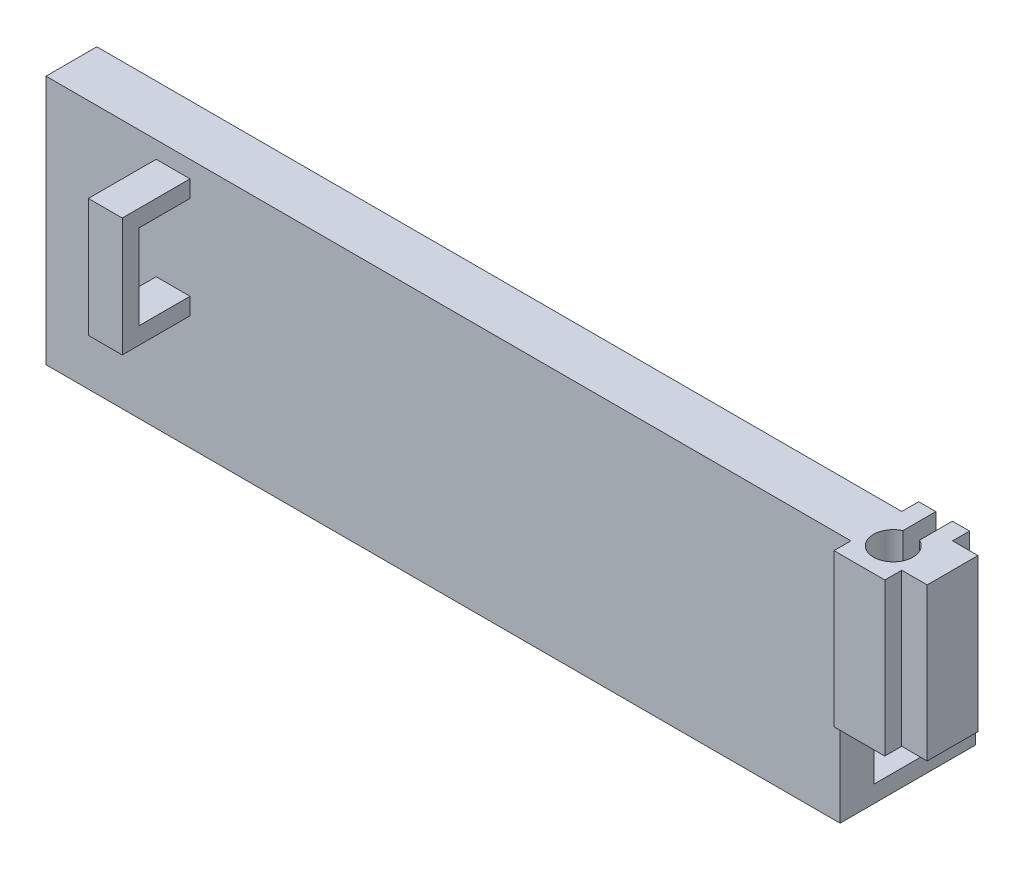
ISO-10303-21;
HEADER;
FILE_DESCRIPTION(('STEP AP214'),'2;1');
FILE_NAME('part.step','',(''),(''),'','','');
FILE_SCHEMA(('AUTOMOTIVE_DESIGN { 1 0 10303 214 1 1 1 1 }'));
ENDSEC;
DATA;
#1=APPLICATION_CONTEXT('core data for automotive mechanical design processes');
#2=APPLICATION_PROTOCOL_DEFINITION('international standard','automotive_design',2000,#1);
#3=PRODUCT_CONTEXT('',#1,'mechanical');
#4=PRODUCT('Part','Part','',(#3));
#5=PRODUCT_RELATED_PRODUCT_CATEGORY('part','',(#4));
#6=PRODUCT_DEFINITION_FORMATION('','',#4);
#7=PRODUCT_DEFINITION_CONTEXT('part definition',#1,'design');
#8=PRODUCT_DEFINITION('design','',#6,#7);
#9=PRODUCT_DEFINITION_SHAPE('','',#8);
#10=(LENGTH_UNIT() NAMED_UNIT(*) SI_UNIT(.MILLI.,.METRE.));
#11=(NAMED_UNIT(*) PLANE_ANGLE_UNIT() SI_UNIT($,.RADIAN.));
#12=(NAMED_UNIT(*) SI_UNIT($,.STERADIAN.) SOLID_ANGLE_UNIT());
#13=UNCERTAINTY_MEASURE_WITH_UNIT(LENGTH_MEASURE(1.E-05),#10,'distance_accuracy_value','');
#14=(GEOMETRIC_REPRESENTATION_CONTEXT(3) GLOBAL_UNCERTAINTY_ASSIGNED_CONTEXT((#13)) GLOBAL_UNIT_ASSIGNED_CONTEXT((#10,
#11,#12)) REPRESENTATION_CONTEXT('',''));
#15=CARTESIAN_POINT('',(0.,0.,0.));
#16=DIRECTION('',(0.,0.,1.));
#17=DIRECTION('',(1.,0.,0.));
#18=AXIS2_PLACEMENT_3D('',#15,#16,#17);
#19=CARTESIAN_POINT('',(2.30885367228764,-2.,0.));
#20=DIRECTION('',(-1.,0.,0.));
#21=DIRECTION('',(0.,0.,1.));
#22=AXIS2_PLACEMENT_3D('',#19,#20,#21);
#23=PLANE('',#22);
#24=DIRECTION('',(0.,0.,-1.));
#25=VECTOR('',#24,1.);
#26=CARTESIAN_POINT('',(2.30885367228764,-1.75,1.));
#27=LINE('',#26,#25);
#28=CARTESIAN_POINT('',(2.30885367228764,-1.75,1.));
#29=VERTEX_POINT('',#28);
#30=CARTESIAN_POINT('',(2.30885367228764,-1.75,0.));
#31=VERTEX_POINT('',#30);
#32=EDGE_CURVE('E68',#29,#31,#27,.T.);
#33=ORIENTED_EDGE('',*,*,#32,.F.);
#34=DIRECTION('',(0.,-1.,0.));
#35=VECTOR('',#34,1.);
#36=CARTESIAN_POINT('',(2.30885367228764,-2.,1.));
#37=LINE('',#36,#35);
#38=CARTESIAN_POINT('',(2.30885367228764,-4.75,1.));
#39=VERTEX_POINT('',#38);
#40=EDGE_CURVE('E368',#29,#39,#37,.T.);
#41=ORIENTED_EDGE('',*,*,#40,.T.);
#42=DIRECTION('',(0.,0.,1.));
#43=VECTOR('',#42,1.);
#44=CARTESIAN_POINT('',(2.30885367228764,-4.75,0.));
#45=LINE('',#44,#43);
#46=CARTESIAN_POINT('',(2.30885367228764,-4.75,0.));
#47=VERTEX_POINT('',#46);
#48=EDGE_CURVE('E310',#47,#39,#45,.T.);
#49=ORIENTED_EDGE('',*,*,#48,.F.);
#50=DIRECTION('',(0.,-1.,0.));
#51=VECTOR('',#50,1.);
#52=CARTESIAN_POINT('',(2.30885367228764,-2.,0.));
#53=LINE('',#52,#51);
#54=EDGE_CURVE('E64',#31,#47,#53,.T.);
#55=ORIENTED_EDGE('',*,*,#54,.F.);
#56=EDGE_LOOP('',(#33,#41,#49,#55));
#57=FACE_BOUND('',#56,.T.);
#58=ADVANCED_FACE('F45',(#57),#23,.F.);
#59=CARTESIAN_POINT('',(2.30885367228764,-2.,1.));
#60=DIRECTION('',(0.,0.,1.));
#61=DIRECTION('',(1.,0.,0.));
#62=AXIS2_PLACEMENT_3D('',#59,#60,#61);
#63=PLANE('',#62);
#64=DIRECTION('',(-1.,0.,0.));
#65=VECTOR('',#64,1.);
#66=CARTESIAN_POINT('',(45.8621739848978,-1.75,1.));
#67=LINE('',#66,#65);
#68=CARTESIAN_POINT('',(45.8621739848978,-1.75,1.));
#69=VERTEX_POINT('',#68);
#70=EDGE_CURVE('E275',#69,#29,#67,.T.);
#71=ORIENTED_EDGE('',*,*,#70,.F.);
#72=DIRECTION('',(0.,-1.,0.));
#73=VECTOR('',#72,1.);
#74=CARTESIAN_POINT('',(45.8621739848978,0.534107686432184,1.));
#75=LINE('',#74,#73);
#76=CARTESIAN_POINT('',(45.8621739848978,-4.75,1.));
#77=VERTEX_POINT('',#76);
#78=EDGE_CURVE('E49',#69,#77,#75,.T.);
#79=ORIENTED_EDGE('',*,*,#78,.T.);
#80=DIRECTION('',(-1.,0.,0.));
#81=VECTOR('',#80,1.);
#82=CARTESIAN_POINT('',(45.8621739848978,-4.75,1.));
#83=LINE('',#82,#81);
#84=EDGE_CURVE('E303',#77,#39,#83,.T.);
#85=ORIENTED_EDGE('',*,*,#84,.T.);
#86=ORIENTED_EDGE('',*,*,#40,.F.);
#87=EDGE_LOOP('',(#71,#79,#85,#86));
#88=FACE_BOUND('',#87,.T.);
#89=ADVANCED_FACE('F622',(#88),#63,.F.);
#90=CARTESIAN_POINT('',(0.,0.,0.));
#91=DIRECTION('',(0.,0.,-1.));
#92=DIRECTION('',(-1.,0.,0.));
#93=AXIS2_PLACEMENT_3D('',#90,#91,#92);
#94=PLANE('',#93);
#95=DIRECTION('',(1.,0.,0.));
#96=VECTOR('',#95,1.);
#97=CARTESIAN_POINT('',(45.8621739848978,-1.75,0.));
#98=LINE('',#97,#96);
#99=CARTESIAN_POINT('',(45.8621739848978,-1.75,0.));
#100=VERTEX_POINT('',#99);
#101=EDGE_CURVE('E252',#31,#100,#98,.T.);
#102=ORIENTED_EDGE('',*,*,#101,.F.);
#103=ORIENTED_EDGE('',*,*,#54,.T.);
#104=DIRECTION('',(1.,0.,0.));
#105=VECTOR('',#104,1.);
#106=CARTESIAN_POINT('',(45.8621739848978,-4.75,0.));
#107=LINE('',#106,#105);
#108=CARTESIAN_POINT('',(-1.,-4.75,0.));
#109=VERTEX_POINT('',#108);
#110=EDGE_CURVE('E269',#109,#47,#107,.T.);
#111=ORIENTED_EDGE('',*,*,#110,.F.);
#112=DIRECTION('',(0.,-1.,0.));
#113=VECTOR('',#112,1.);
#114=CARTESIAN_POINT('',(-1.,9.,0.));
#115=LINE('',#114,#113);
#116=CARTESIAN_POINT('',(-1.,9.,0.));
#117=VERTEX_POINT('',#116);
#118=EDGE_CURVE('E357',#117,#109,#115,.T.);
#119=ORIENTED_EDGE('',*,*,#118,.F.);
#120=DIRECTION('',(-1.,0.,0.));
#121=VECTOR('',#120,1.);
#122=CARTESIAN_POINT('',(0.,9.,0.));
#123=LINE('',#122,#121);
#124=CARTESIAN_POINT('',(46.5,9.,0.));
#125=VERTEX_POINT('',#124);
#126=EDGE_CURVE('E566',#125,#117,#123,.T.);
#127=ORIENTED_EDGE('',*,*,#126,.F.);
#128=DIRECTION('',(0.,1.,0.));
#129=VECTOR('',#128,1.);
#130=CARTESIAN_POINT('',(46.5,9.,0.));
#131=LINE('',#130,#129);
#132=CARTESIAN_POINT('',(46.5,0.,0.));
#133=VERTEX_POINT('',#132);
#134=EDGE_CURVE('E413',#133,#125,#131,.T.);
#135=ORIENTED_EDGE('',*,*,#134,.F.);
#136=DIRECTION('',(1.,0.,0.));
#137=VECTOR('',#136,1.);
#138=CARTESIAN_POINT('',(0.,0.,0.));
#139=LINE('',#138,#137);
#140=CARTESIAN_POINT('',(45.8621739848978,0.,0.));
#141=VERTEX_POINT('',#140);
#142=EDGE_CURVE('E254',#141,#133,#139,.T.);
#143=ORIENTED_EDGE('',*,*,#142,.F.);
#144=DIRECTION('',(0.,1.,0.));
#145=VECTOR('',#144,1.);
#146=CARTESIAN_POINT('',(45.8621739848978,-1.5,0.));
#147=LINE('',#146,#145);
#148=EDGE_CURVE('E249',#100,#141,#147,.T.);
#149=ORIENTED_EDGE('',*,*,#148,.F.);
#150=EDGE_LOOP('',(#102,#103,#111,#119,#127,#135,#143,#149));
#151=FACE_BOUND('',#150,.T.);
#152=ADVANCED_FACE('F251',(#151),#94,.T.);
#153=CARTESIAN_POINT('',(0.,0.,3.));
#154=DIRECTION('',(0.,0.,-1.));
#155=DIRECTION('',(-1.,0.,0.));
#156=AXIS2_PLACEMENT_3D('',#153,#154,#155);
#157=PLANE('',#156);
#158=DIRECTION('',(0.,-1.,0.));
#159=VECTOR('',#158,1.);
#160=CARTESIAN_POINT('',(5.5,8.,3.));
#161=LINE('',#160,#159);
#162=CARTESIAN_POINT('',(5.5,8.,3.));
#163=VERTEX_POINT('',#162);
#164=CARTESIAN_POINT('',(5.5,7.,3.));
#165=VERTEX_POINT('',#164);
#166=EDGE_CURVE('E329',#163,#165,#161,.T.);
#167=ORIENTED_EDGE('',*,*,#166,.F.);
#168=DIRECTION('',(-1.,0.,0.));
#169=VECTOR('',#168,1.);
#170=CARTESIAN_POINT('',(6.5,8.,3.));
#171=LINE('',#170,#169);
#172=CARTESIAN_POINT('',(7.5,8.,3.));
#173=VERTEX_POINT('',#172);
#174=EDGE_CURVE('E475',#173,#163,#171,.T.);
#175=ORIENTED_EDGE('',*,*,#174,.F.);
#176=DIRECTION('',(0.,1.,0.));
#177=VECTOR('',#176,1.);
#178=CARTESIAN_POINT('',(7.5,6.99999999999999,3.));
#179=LINE('',#178,#177);
#180=CARTESIAN_POINT('',(7.5,6.99999999999999,3.));
#181=VERTEX_POINT('',#180);
#182=EDGE_CURVE('E471',#181,#173,#179,.T.);
#183=ORIENTED_EDGE('',*,*,#182,.F.);
#184=DIRECTION('',(1.,0.,0.));
#185=VECTOR('',#184,1.);
#186=CARTESIAN_POINT('',(6.5,7.,3.));
#187=LINE('',#186,#185);
#188=EDGE_CURVE('E467',#165,#181,#187,.T.);
#189=ORIENTED_EDGE('',*,*,#188,.F.);
#190=EDGE_LOOP('',(#167,#175,#183,#189));
#191=FACE_BOUND('',#190,.T.);
#192=DIRECTION('',(0.,1.,0.));
#193=VECTOR('',#192,1.);
#194=CARTESIAN_POINT('',(-1.,9.,3.));
#195=LINE('',#194,#193);
#196=CARTESIAN_POINT('',(-1.,-5.75,3.));
#197=VERTEX_POINT('',#196);
#198=CARTESIAN_POINT('',(-1.,9.,3.));
#199=VERTEX_POINT('',#198);
#200=EDGE_CURVE('E361',#197,#199,#195,.T.);
#201=ORIENTED_EDGE('',*,*,#200,.F.);
#202=DIRECTION('',(-1.,0.,0.));
#203=VECTOR('',#202,1.);
#204=CARTESIAN_POINT('',(-1.,-5.75,3.));
#205=LINE('',#204,#203);
#206=CARTESIAN_POINT('',(45.8621739848978,-5.75,3.));
#207=VERTEX_POINT('',#206);
#208=EDGE_CURVE('E318',#207,#197,#205,.T.);
#209=ORIENTED_EDGE('',*,*,#208,.F.);
#210=DIRECTION('',(0.,1.,0.));
#211=VECTOR('',#210,1.);
#212=CARTESIAN_POINT('',(45.8621739848978,-1.5,3.00000000000001));
#213=LINE('',#212,#211);
#214=CARTESIAN_POINT('',(45.8621739848978,0.,3.00000000000001));
#215=VERTEX_POINT('',#214);
#216=EDGE_CURVE('E260',#207,#215,#213,.T.);
#217=ORIENTED_EDGE('',*,*,#216,.T.);
#218=DIRECTION('',(1.,0.,0.));
#219=VECTOR('',#218,1.);
#220=CARTESIAN_POINT('',(0.,0.,3.));
#221=LINE('',#220,#219);
#222=CARTESIAN_POINT('',(46.5,0.,3.));
#223=VERTEX_POINT('',#222);
#224=EDGE_CURVE('E557',#215,#223,#221,.T.);
#225=ORIENTED_EDGE('',*,*,#224,.T.);
#226=DIRECTION('',(0.,-1.,0.));
#227=VECTOR('',#226,1.);
#228=CARTESIAN_POINT('',(46.5,9.,3.));
#229=LINE('',#228,#227);
#230=CARTESIAN_POINT('',(46.5,9.,3.));
#231=VERTEX_POINT('',#230);
#232=EDGE_CURVE('E488',#231,#223,#229,.T.);
#233=ORIENTED_EDGE('',*,*,#232,.F.);
#234=DIRECTION('',(-1.,0.,0.));
#235=VECTOR('',#234,1.);
#236=CARTESIAN_POINT('',(0.,9.,3.));
#237=LINE('',#236,#235);
#238=EDGE_CURVE('E560',#231,#199,#237,.T.);
#239=ORIENTED_EDGE('',*,*,#238,.T.);
#240=EDGE_LOOP('',(#201,#209,#217,#225,#233,#239));
#241=FACE_BOUND('',#240,.T.);
#242=DIRECTION('',(0.,-1.,0.));
#243=VECTOR('',#242,1.);
#244=CARTESIAN_POINT('',(5.49999999999999,2.,3.));
#245=LINE('',#244,#243);
#246=CARTESIAN_POINT('',(5.49999999999999,2.,3.));
#247=VERTEX_POINT('',#246);
#248=CARTESIAN_POINT('',(5.49999999999999,0.999999999999999,3.));
#249=VERTEX_POINT('',#248);
#250=EDGE_CURVE('E345',#247,#249,#245,.T.);
#251=ORIENTED_EDGE('',*,*,#250,.F.);
#252=DIRECTION('',(-1.,0.,0.));
#253=VECTOR('',#252,1.);
#254=CARTESIAN_POINT('',(6.5,2.,3.));
#255=LINE('',#254,#253);
#256=CARTESIAN_POINT('',(7.5,2.,3.));
#257=VERTEX_POINT('',#256);
#258=EDGE_CURVE('E496',#257,#247,#255,.T.);
#259=ORIENTED_EDGE('',*,*,#258,.F.);
#260=DIRECTION('',(0.,1.,0.));
#261=VECTOR('',#260,1.);
#262=CARTESIAN_POINT('',(7.5,2.,3.));
#263=LINE('',#262,#261);
#264=CARTESIAN_POINT('',(7.5,0.999999999999998,3.));
#265=VERTEX_POINT('',#264);
#266=EDGE_CURVE('E499',#265,#257,#263,.T.);
#267=ORIENTED_EDGE('',*,*,#266,.F.);
#268=DIRECTION('',(1.,0.,0.));
#269=VECTOR('',#268,1.);
#270=CARTESIAN_POINT('',(6.5,0.999999999999998,3.));
#271=LINE('',#270,#269);
#272=EDGE_CURVE('E476',#249,#265,#271,.T.);
#273=ORIENTED_EDGE('',*,*,#272,.F.);
#274=EDGE_LOOP('',(#251,#259,#267,#273));
#275=FACE_BOUND('',#274,.T.);
#276=ADVANCED_FACE('F577',(#191,#241,#275),#157,.F.);
#277=CARTESIAN_POINT('',(0.,0.,-1.));
#278=DIRECTION('',(0.,0.,-1.));
#279=DIRECTION('',(-1.,0.,0.));
#280=AXIS2_PLACEMENT_3D('',#277,#278,#279);
#281=PLANE('',#280);
#282=DIRECTION('',(0.,1.,0.));
#283=VECTOR('',#282,1.);
#284=CARTESIAN_POINT('',(47.5107724503586,-2.17229439886714,-1.));
#285=LINE('',#284,#283);
#286=CARTESIAN_POINT('',(47.5107724503586,0.,-1.));
#287=VERTEX_POINT('',#286);
#288=CARTESIAN_POINT('',(47.5107724503586,9.,-1.));
#289=VERTEX_POINT('',#288);
#290=EDGE_CURVE('E388',#287,#289,#285,.T.);
#291=ORIENTED_EDGE('',*,*,#290,.F.);
#292=DIRECTION('',(-1.,0.,0.));
#293=VECTOR('',#292,1.);
#294=CARTESIAN_POINT('',(49.5,0.,-1.));
#295=LINE('',#294,#293);
#296=CARTESIAN_POINT('',(46.5,0.,-1.));
#297=VERTEX_POINT('',#296);
#298=EDGE_CURVE('E412',#287,#297,#295,.T.);
#299=ORIENTED_EDGE('',*,*,#298,.T.);
#300=DIRECTION('',(0.,1.,0.));
#301=VECTOR('',#300,1.);
#302=CARTESIAN_POINT('',(46.5,9.,-1.));
#303=LINE('',#302,#301);
#304=CARTESIAN_POINT('',(46.5,9.,-1.));
#305=VERTEX_POINT('',#304);
#306=EDGE_CURVE('E418',#297,#305,#303,.T.);
#307=ORIENTED_EDGE('',*,*,#306,.T.);
#308=DIRECTION('',(1.,0.,0.));
#309=VECTOR('',#308,1.);
#310=CARTESIAN_POINT('',(49.5,9.,-1.));
#311=LINE('',#310,#309);
#312=EDGE_CURVE('E422',#305,#289,#311,.T.);
#313=ORIENTED_EDGE('',*,*,#312,.T.);
#314=EDGE_LOOP('',(#291,#299,#307,#313));
#315=FACE_BOUND('',#314,.T.);
#316=ADVANCED_FACE('F654',(#315),#281,.T.);
#317=DIRECTION('',(0.,-1.,0.));
#318=VECTOR('',#317,1.);
#319=CARTESIAN_POINT('',(49.5,9.,0.));
#320=LINE('',#319,#318);
#321=CARTESIAN_POINT('',(49.5,9.,0.));
#322=VERTEX_POINT('',#321);
#323=CARTESIAN_POINT('',(49.5,0.,0.));
#324=VERTEX_POINT('',#323);
#325=EDGE_CURVE('E407',#322,#324,#320,.T.);
#326=ORIENTED_EDGE('',*,*,#325,.F.);
#327=CARTESIAN_POINT('',(51.,9.,0.));
#328=VERTEX_POINT('',#327);
#329=EDGE_CURVE('E567',#328,#322,#123,.T.);
#330=ORIENTED_EDGE('',*,*,#329,.F.);
#331=DIRECTION('',(0.,1.,0.));
#332=VECTOR('',#331,1.);
#333=CARTESIAN_POINT('',(51.,0.,0.));
#334=LINE('',#333,#332);
#335=CARTESIAN_POINT('',(51.,0.,0.));
#336=VERTEX_POINT('',#335);
#337=EDGE_CURVE('E11',#336,#328,#334,.T.);
#338=ORIENTED_EDGE('',*,*,#337,.F.);
#339=EDGE_CURVE('E554',#324,#336,#139,.T.);
#340=ORIENTED_EDGE('',*,*,#339,.F.);
#341=EDGE_LOOP('',(#326,#330,#338,#340));
#342=FACE_BOUND('',#341,.T.);
#343=ADVANCED_FACE('F608',(#342),#94,.T.);
#344=CARTESIAN_POINT('',(0.,0.,3.));
#345=DIRECTION('',(0.,1.,0.));
#346=DIRECTION('',(0.,0.,1.));
#347=AXIS2_PLACEMENT_3D('',#344,#345,#346);
#348=PLANE('',#347);
#349=ORIENTED_EDGE('',*,*,#298,.F.);
#350=DIRECTION('',(0.,0.,-1.));
#351=VECTOR('',#350,1.);
#352=CARTESIAN_POINT('',(47.5107724503586,0.,-1.));
#353=LINE('',#352,#351);
#354=CARTESIAN_POINT('',(47.5107724503586,0.,0.939455741706152));
#355=VERTEX_POINT('',#354);
#356=EDGE_CURVE('E374',#355,#287,#353,.T.);
#357=ORIENTED_EDGE('',*,*,#356,.F.);
#358=CARTESIAN_POINT('',(48.,0.,2.));
#359=DIRECTION('',(0.,1.,0.));
#360=DIRECTION('',(0.,0.,1.));
#361=AXIS2_PLACEMENT_3D('',#358,#359,#360);
#362=CIRCLE('',#361,1.16794594015656);
#363=CARTESIAN_POINT('',(48.4892275496414,0.,0.939455741706152));
#364=VERTEX_POINT('',#363);
#365=EDGE_CURVE('E403',#364,#355,#362,.F.);
#366=ORIENTED_EDGE('',*,*,#365,.F.);
#367=DIRECTION('',(0.,0.,1.));
#368=VECTOR('',#367,1.);
#369=CARTESIAN_POINT('',(48.4892275496414,0.,-1.));
#370=LINE('',#369,#368);
#371=CARTESIAN_POINT('',(48.4892275496414,0.,-1.));
#372=VERTEX_POINT('',#371);
#373=EDGE_CURVE('E377',#372,#364,#370,.T.);
#374=ORIENTED_EDGE('',*,*,#373,.F.);
#375=CARTESIAN_POINT('',(49.5,0.,-1.));
#376=VERTEX_POINT('',#375);
#377=EDGE_CURVE('E414',#376,#372,#295,.T.);
#378=ORIENTED_EDGE('',*,*,#377,.F.);
#379=DIRECTION('',(0.,0.,1.));
#380=VECTOR('',#379,1.);
#381=CARTESIAN_POINT('',(49.5,0.,-1.));
#382=LINE('',#381,#380);
#383=EDGE_CURVE('E444',#376,#324,#382,.T.);
#384=ORIENTED_EDGE('',*,*,#383,.T.);
#385=ORIENTED_EDGE('',*,*,#339,.T.);
#386=DIRECTION('',(0.,0.,1.));
#387=VECTOR('',#386,1.);
#388=CARTESIAN_POINT('',(51.,0.,-2.));
#389=LINE('',#388,#387);
#390=CARTESIAN_POINT('',(51.,0.,3.));
#391=VERTEX_POINT('',#390);
#392=EDGE_CURVE('E550',#336,#391,#389,.T.);
#393=ORIENTED_EDGE('',*,*,#392,.T.);
#394=CARTESIAN_POINT('',(49.5,0.,3.));
#395=VERTEX_POINT('',#394);
#396=EDGE_CURVE('E561',#395,#391,#221,.T.);
#397=ORIENTED_EDGE('',*,*,#396,.F.);
#398=DIRECTION('',(0.,0.,-1.));
#399=VECTOR('',#398,1.);
#400=CARTESIAN_POINT('',(49.5,0.,4.));
#401=LINE('',#400,#399);
#402=CARTESIAN_POINT('',(49.5,0.,4.));
#403=VERTEX_POINT('',#402);
#404=EDGE_CURVE('E537',#403,#395,#401,.T.);
#405=ORIENTED_EDGE('',*,*,#404,.F.);
#406=DIRECTION('',(1.,0.,0.));
#407=VECTOR('',#406,1.);
#408=CARTESIAN_POINT('',(46.5,0.,4.));
#409=LINE('',#408,#407);
#410=CARTESIAN_POINT('',(46.5,0.,4.));
#411=VERTEX_POINT('',#410);
#412=EDGE_CURVE('E513',#411,#403,#409,.T.);
#413=ORIENTED_EDGE('',*,*,#412,.F.);
#414=DIRECTION('',(0.,0.,-1.));
#415=VECTOR('',#414,1.);
#416=CARTESIAN_POINT('',(46.5,0.,4.));
#417=LINE('',#416,#415);
#418=EDGE_CURVE('E541',#411,#223,#417,.T.);
#419=ORIENTED_EDGE('',*,*,#418,.T.);
#420=ORIENTED_EDGE('',*,*,#224,.F.);
#421=DIRECTION('',(0.,0.,1.));
#422=VECTOR('',#421,1.);
#423=CARTESIAN_POINT('',(45.8621739848978,0.,0.));
#424=LINE('',#423,#422);
#425=EDGE_CURVE('E261',#141,#215,#424,.T.);
#426=ORIENTED_EDGE('',*,*,#425,.F.);
#427=ORIENTED_EDGE('',*,*,#142,.T.);
#428=DIRECTION('',(0.,0.,1.));
#429=VECTOR('',#428,1.);
#430=CARTESIAN_POINT('',(46.5,0.,-1.));
#431=LINE('',#430,#429);
#432=EDGE_CURVE('E440',#297,#133,#431,.T.);
#433=ORIENTED_EDGE('',*,*,#432,.F.);
#434=EDGE_LOOP('',(#349,#357,#366,#374,#378,#384,#385,#393,#397,#405,#413,#419,#420,#426,#427,#433));
#435=FACE_BOUND('',#434,.T.);
#436=ADVANCED_FACE('F47',(#435),#348,.F.);
#437=CARTESIAN_POINT('',(6.5,2.,7.));
#438=DIRECTION('',(0.,-1.,0.));
#439=DIRECTION('',(1.,0.,0.));
#440=AXIS2_PLACEMENT_3D('',#437,#438,#439);
#441=PLANE('',#440);
#442=DIRECTION('',(1.,0.,0.));
#443=VECTOR('',#442,1.);
#444=CARTESIAN_POINT('',(6.5,2.,6.));
#445=LINE('',#444,#443);
#446=CARTESIAN_POINT('',(5.49999999999999,2.,6.));
#447=VERTEX_POINT('',#446);
#448=CARTESIAN_POINT('',(7.5,2.,6.));
#449=VERTEX_POINT('',#448);
#450=EDGE_CURVE('E455',#447,#449,#445,.T.);
#451=ORIENTED_EDGE('',*,*,#450,.T.);
#452=DIRECTION('',(0.,0.,-1.));
#453=VECTOR('',#452,1.);
#454=CARTESIAN_POINT('',(7.5,2.,7.));
#455=LINE('',#454,#453);
#456=EDGE_CURVE('E492',#449,#257,#455,.T.);
#457=ORIENTED_EDGE('',*,*,#456,.T.);
#458=ORIENTED_EDGE('',*,*,#258,.T.);
#459=DIRECTION('',(0.,0.,-1.));
#460=VECTOR('',#459,1.);
#461=CARTESIAN_POINT('',(5.49999999999999,2.,6.));
#462=LINE('',#461,#460);
#463=EDGE_CURVE('E341',#447,#247,#462,.T.);
#464=ORIENTED_EDGE('',*,*,#463,.F.);
#465=EDGE_LOOP('',(#451,#457,#458,#464));
#466=FACE_BOUND('',#465,.T.);
#467=ADVANCED_FACE('F675',(#466),#441,.F.);
#468=CARTESIAN_POINT('',(6.5,7.,7.));
#469=DIRECTION('',(0.,1.,0.));
#470=DIRECTION('',(-1.,0.,0.));
#471=AXIS2_PLACEMENT_3D('',#468,#469,#470);
#472=PLANE('',#471);
#473=DIRECTION('',(1.,0.,0.));
#474=VECTOR('',#473,1.);
#475=CARTESIAN_POINT('',(6.5,7.,6.));
#476=LINE('',#475,#474);
#477=CARTESIAN_POINT('',(5.5,7.,6.));
#478=VERTEX_POINT('',#477);
#479=CARTESIAN_POINT('',(7.5,7.,6.));
#480=VERTEX_POINT('',#479);
#481=EDGE_CURVE('E450',#478,#480,#476,.T.);
#482=ORIENTED_EDGE('',*,*,#481,.F.);
#483=DIRECTION('',(0.,0.,1.));
#484=VECTOR('',#483,1.);
#485=CARTESIAN_POINT('',(5.5,7.,3.));
#486=LINE('',#485,#484);
#487=EDGE_CURVE('E333',#165,#478,#486,.T.);
#488=ORIENTED_EDGE('',*,*,#487,.F.);
#489=ORIENTED_EDGE('',*,*,#188,.T.);
#490=DIRECTION('',(0.,0.,-1.));
#491=VECTOR('',#490,1.);
#492=CARTESIAN_POINT('',(7.5,6.99999999999999,7.));
#493=LINE('',#492,#491);
#494=EDGE_CURVE('E470',#480,#181,#493,.T.);
#495=ORIENTED_EDGE('',*,*,#494,.F.);
#496=EDGE_LOOP('',(#482,#488,#489,#495));
#497=FACE_BOUND('',#496,.T.);
#498=ADVANCED_FACE('F671',(#497),#472,.F.);
#499=DIRECTION('',(0.,1.,0.));
#500=VECTOR('',#499,1.);
#501=CARTESIAN_POINT('',(49.5,9.,3.));
#502=LINE('',#501,#500);
#503=CARTESIAN_POINT('',(49.5,9.,3.));
#504=VERTEX_POINT('',#503);
#505=EDGE_CURVE('E514',#395,#504,#502,.T.);
#506=ORIENTED_EDGE('',*,*,#505,.F.);
#507=ORIENTED_EDGE('',*,*,#396,.T.);
#508=DIRECTION('',(0.,-1.,0.));
#509=VECTOR('',#508,1.);
#510=CARTESIAN_POINT('',(51.,9.,3.));
#511=LINE('',#510,#509);
#512=CARTESIAN_POINT('',(51.,9.,3.));
#513=VERTEX_POINT('',#512);
#514=EDGE_CURVE('E545',#513,#391,#511,.T.);
#515=ORIENTED_EDGE('',*,*,#514,.F.);
#516=EDGE_CURVE('E56',#513,#504,#237,.T.);
#517=ORIENTED_EDGE('',*,*,#516,.T.);
#518=EDGE_LOOP('',(#506,#507,#515,#517));
#519=FACE_BOUND('',#518,.T.);
#520=ADVANCED_FACE('F674',(#519),#157,.F.);
#521=CARTESIAN_POINT('',(0.,9.,3.));
#522=DIRECTION('',(0.,-1.,0.));
#523=DIRECTION('',(0.,0.,-1.));
#524=AXIS2_PLACEMENT_3D('',#521,#522,#523);
#525=PLANE('',#524);
#526=CARTESIAN_POINT('',(48.,9.,2.));
#527=DIRECTION('',(0.,1.,0.));
#528=DIRECTION('',(0.,0.,1.));
#529=AXIS2_PLACEMENT_3D('',#526,#527,#528);
#530=CIRCLE('',#529,1.16794594015656);
#531=CARTESIAN_POINT('',(47.5107724503586,9.,0.939455741706152));
#532=VERTEX_POINT('',#531);
#533=CARTESIAN_POINT('',(48.4892275496414,9.,0.939455741706152));
#534=VERTEX_POINT('',#533);
#535=EDGE_CURVE('E399',#532,#534,#530,.T.);
#536=ORIENTED_EDGE('',*,*,#535,.F.);
#537=DIRECTION('',(0.,0.,1.));
#538=VECTOR('',#537,1.);
#539=CARTESIAN_POINT('',(47.5107724503586,9.,-1.));
#540=LINE('',#539,#538);
#541=EDGE_CURVE('E381',#289,#532,#540,.T.);
#542=ORIENTED_EDGE('',*,*,#541,.F.);
#543=ORIENTED_EDGE('',*,*,#312,.F.);
#544=DIRECTION('',(0.,0.,1.));
#545=VECTOR('',#544,1.);
#546=CARTESIAN_POINT('',(46.5,9.,-1.));
#547=LINE('',#546,#545);
#548=EDGE_CURVE('E436',#305,#125,#547,.T.);
#549=ORIENTED_EDGE('',*,*,#548,.T.);
#550=ORIENTED_EDGE('',*,*,#126,.T.);
#551=DIRECTION('',(0.,0.,-1.));
#552=VECTOR('',#551,1.);
#553=CARTESIAN_POINT('',(-1.,9.,0.));
#554=LINE('',#553,#552);
#555=EDGE_CURVE('E364',#199,#117,#554,.T.);
#556=ORIENTED_EDGE('',*,*,#555,.F.);
#557=ORIENTED_EDGE('',*,*,#238,.F.);
#558=DIRECTION('',(0.,0.,-1.));
#559=VECTOR('',#558,1.);
#560=CARTESIAN_POINT('',(46.5,9.,4.));
#561=LINE('',#560,#559);
#562=CARTESIAN_POINT('',(46.5,9.,4.));
#563=VERTEX_POINT('',#562);
#564=EDGE_CURVE('E523',#563,#231,#561,.T.);
#565=ORIENTED_EDGE('',*,*,#564,.F.);
#566=DIRECTION('',(-1.,0.,0.));
#567=VECTOR('',#566,1.);
#568=CARTESIAN_POINT('',(46.5,9.,4.));
#569=LINE('',#568,#567);
#570=CARTESIAN_POINT('',(49.5,9.,4.));
#571=VERTEX_POINT('',#570);
#572=EDGE_CURVE('E520',#571,#563,#569,.T.);
#573=ORIENTED_EDGE('',*,*,#572,.F.);
#574=DIRECTION('',(0.,0.,-1.));
#575=VECTOR('',#574,1.);
#576=CARTESIAN_POINT('',(49.5,9.,4.));
#577=LINE('',#576,#575);
#578=EDGE_CURVE('E533',#571,#504,#577,.T.);
#579=ORIENTED_EDGE('',*,*,#578,.T.);
#580=ORIENTED_EDGE('',*,*,#516,.F.);
#581=DIRECTION('',(0.,0.,1.));
#582=VECTOR('',#581,1.);
#583=CARTESIAN_POINT('',(51.,9.,-2.));
#584=LINE('',#583,#582);
#585=EDGE_CURVE('E549',#328,#513,#584,.T.);
#586=ORIENTED_EDGE('',*,*,#585,.F.);
#587=ORIENTED_EDGE('',*,*,#329,.T.);
#588=DIRECTION('',(0.,0.,1.));
#589=VECTOR('',#588,1.);
#590=CARTESIAN_POINT('',(49.5,9.,-1.));
#591=LINE('',#590,#589);
#592=CARTESIAN_POINT('',(49.5,9.,-1.));
#593=VERTEX_POINT('',#592);
#594=EDGE_CURVE('E426',#593,#322,#591,.T.);
#595=ORIENTED_EDGE('',*,*,#594,.F.);
#596=CARTESIAN_POINT('',(48.4892275496414,9.,-1.));
#597=VERTEX_POINT('',#596);
#598=EDGE_CURVE('E421',#597,#593,#311,.T.);
#599=ORIENTED_EDGE('',*,*,#598,.F.);
#600=DIRECTION('',(0.,0.,-1.));
#601=VECTOR('',#600,1.);
#602=CARTESIAN_POINT('',(48.4892275496414,9.,-1.));
#603=LINE('',#602,#601);
#604=EDGE_CURVE('E371',#534,#597,#603,.T.);
#605=ORIENTED_EDGE('',*,*,#604,.F.);
#606=EDGE_LOOP('',(#536,#542,#543,#549,#550,#556,#557,#565,#573,#579,#580,#586,#587,#595,#599,#605));
#607=FACE_BOUND('',#606,.T.);
#608=ADVANCED_FACE('F592',(#607),#525,.F.);
#609=CARTESIAN_POINT('',(51.,9.,-2.));
#610=DIRECTION('',(-1.,0.,0.));
#611=DIRECTION('',(0.,0.,1.));
#612=AXIS2_PLACEMENT_3D('',#609,#610,#611);
#613=PLANE('',#612);
#614=ORIENTED_EDGE('',*,*,#337,.T.);
#615=ORIENTED_EDGE('',*,*,#585,.T.);
#616=ORIENTED_EDGE('',*,*,#514,.T.);
#617=ORIENTED_EDGE('',*,*,#392,.F.);
#618=EDGE_LOOP('',(#614,#615,#616,#617));
#619=FACE_BOUND('',#618,.T.);
#620=ADVANCED_FACE('F604',(#619),#613,.F.);
#621=CARTESIAN_POINT('',(46.5,9.,4.));
#622=DIRECTION('',(1.,0.,0.));
#623=DIRECTION('',(0.,0.,-1.));
#624=AXIS2_PLACEMENT_3D('',#621,#622,#623);
#625=PLANE('',#624);
#626=ORIENTED_EDGE('',*,*,#232,.T.);
#627=ORIENTED_EDGE('',*,*,#418,.F.);
#628=DIRECTION('',(0.,-1.,0.));
#629=VECTOR('',#628,1.);
#630=CARTESIAN_POINT('',(46.5,9.,4.));
#631=LINE('',#630,#629);
#632=EDGE_CURVE('E509',#563,#411,#631,.T.);
#633=ORIENTED_EDGE('',*,*,#632,.F.);
#634=ORIENTED_EDGE('',*,*,#564,.T.);
#635=EDGE_LOOP('',(#626,#627,#633,#634));
#636=FACE_BOUND('',#635,.T.);
#637=ADVANCED_FACE('F585',(#636),#625,.F.);
#638=CARTESIAN_POINT('',(49.5,9.,4.));
#639=DIRECTION('',(-1.,0.,0.));
#640=DIRECTION('',(0.,0.,1.));
#641=AXIS2_PLACEMENT_3D('',#638,#639,#640);
#642=PLANE('',#641);
#643=ORIENTED_EDGE('',*,*,#505,.T.);
#644=ORIENTED_EDGE('',*,*,#578,.F.);
#645=DIRECTION('',(0.,1.,0.));
#646=VECTOR('',#645,1.);
#647=CARTESIAN_POINT('',(49.5,9.,4.));
#648=LINE('',#647,#646);
#649=EDGE_CURVE('E517',#403,#571,#648,.T.);
#650=ORIENTED_EDGE('',*,*,#649,.F.);
#651=ORIENTED_EDGE('',*,*,#404,.T.);
#652=EDGE_LOOP('',(#643,#644,#650,#651));
#653=FACE_BOUND('',#652,.T.);
#654=ADVANCED_FACE('F694',(#653),#642,.F.);
#655=CARTESIAN_POINT('',(0.,0.,4.));
#656=DIRECTION('',(0.,0.,1.));
#657=DIRECTION('',(1.,0.,0.));
#658=AXIS2_PLACEMENT_3D('',#655,#656,#657);
#659=PLANE('',#658);
#660=ORIENTED_EDGE('',*,*,#632,.T.);
#661=ORIENTED_EDGE('',*,*,#412,.T.);
#662=ORIENTED_EDGE('',*,*,#649,.T.);
#663=ORIENTED_EDGE('',*,*,#572,.T.);
#664=EDGE_LOOP('',(#660,#661,#662,#663));
#665=FACE_BOUND('',#664,.T.);
#666=ADVANCED_FACE('F687',(#665),#659,.T.);
#667=CARTESIAN_POINT('',(6.5,0.999999999999998,7.));
#668=DIRECTION('',(0.,1.,0.));
#669=DIRECTION('',(0.,0.,1.));
#670=AXIS2_PLACEMENT_3D('',#667,#668,#669);
#671=PLANE('',#670);
#672=ORIENTED_EDGE('',*,*,#272,.T.);
#673=DIRECTION('',(0.,0.,-1.));
#674=VECTOR('',#673,1.);
#675=CARTESIAN_POINT('',(7.5,0.999999999999998,7.));
#676=LINE('',#675,#674);
#677=CARTESIAN_POINT('',(7.5,0.999999999999998,7.));
#678=VERTEX_POINT('',#677);
#679=EDGE_CURVE('E459',#678,#265,#676,.T.);
#680=ORIENTED_EDGE('',*,*,#679,.F.);
#681=DIRECTION('',(1.,0.,0.));
#682=VECTOR('',#681,1.);
#683=CARTESIAN_POINT('',(6.5,0.999999999999998,7.));
#684=LINE('',#683,#682);
#685=CARTESIAN_POINT('',(5.49999999999999,0.999999999999999,7.));
#686=VERTEX_POINT('',#685);
#687=EDGE_CURVE('E495',#686,#678,#684,.T.);
#688=ORIENTED_EDGE('',*,*,#687,.F.);
#689=DIRECTION('',(0.,0.,1.));
#690=VECTOR('',#689,1.);
#691=CARTESIAN_POINT('',(5.49999999999999,0.999999999999999,3.));
#692=LINE('',#691,#690);
#693=EDGE_CURVE('E349',#249,#686,#692,.T.);
#694=ORIENTED_EDGE('',*,*,#693,.F.);
#695=EDGE_LOOP('',(#672,#680,#688,#694));
#696=FACE_BOUND('',#695,.T.);
#697=ADVANCED_FACE('F683',(#696),#671,.F.);
#698=CARTESIAN_POINT('',(7.5,6.99999999999999,7.));
#699=DIRECTION('',(-1.,0.,0.));
#700=DIRECTION('',(0.,0.,1.));
#701=AXIS2_PLACEMENT_3D('',#698,#699,#700);
#702=PLANE('',#701);
#703=ORIENTED_EDGE('',*,*,#182,.T.);
#704=DIRECTION('',(0.,0.,-1.));
#705=VECTOR('',#704,1.);
#706=CARTESIAN_POINT('',(7.5,8.,7.));
#707=LINE('',#706,#705);
#708=CARTESIAN_POINT('',(7.5,8.,7.));
#709=VERTEX_POINT('',#708);
#710=EDGE_CURVE('E484',#709,#173,#707,.T.);
#711=ORIENTED_EDGE('',*,*,#710,.F.);
#712=DIRECTION('',(0.,1.,0.));
#713=VECTOR('',#712,1.);
#714=CARTESIAN_POINT('',(7.5,6.99999999999999,7.));
#715=LINE('',#714,#713);
#716=EDGE_CURVE('E462',#678,#709,#715,.T.);
#717=ORIENTED_EDGE('',*,*,#716,.F.);
#718=ORIENTED_EDGE('',*,*,#679,.T.);
#719=ORIENTED_EDGE('',*,*,#266,.T.);
#720=ORIENTED_EDGE('',*,*,#456,.F.);
#721=DIRECTION('',(0.,1.,0.));
#722=VECTOR('',#721,1.);
#723=CARTESIAN_POINT('',(7.5,0.585786437626904,6.));
#724=LINE('',#723,#722);
#725=EDGE_CURVE('E454',#449,#480,#724,.T.);
#726=ORIENTED_EDGE('',*,*,#725,.T.);
#727=ORIENTED_EDGE('',*,*,#494,.T.);
#728=EDGE_LOOP('',(#703,#711,#717,#718,#719,#720,#726,#727));
#729=FACE_BOUND('',#728,.T.);
#730=ADVANCED_FACE('F679',(#729),#702,.F.);
#731=CARTESIAN_POINT('',(6.5,8.,7.));
#732=DIRECTION('',(0.,-1.,0.));
#733=DIRECTION('',(0.,0.,-1.));
#734=AXIS2_PLACEMENT_3D('',#731,#732,#733);
#735=PLANE('',#734);
#736=ORIENTED_EDGE('',*,*,#174,.T.);
#737=DIRECTION('',(0.,0.,-1.));
#738=VECTOR('',#737,1.);
#739=CARTESIAN_POINT('',(5.5,8.,7.));
#740=LINE('',#739,#738);
#741=CARTESIAN_POINT('',(5.5,8.,7.));
#742=VERTEX_POINT('',#741);
#743=EDGE_CURVE('E325',#742,#163,#740,.T.);
#744=ORIENTED_EDGE('',*,*,#743,.F.);
#745=DIRECTION('',(-1.,0.,0.));
#746=VECTOR('',#745,1.);
#747=CARTESIAN_POINT('',(6.5,8.,7.));
#748=LINE('',#747,#746);
#749=EDGE_CURVE('E466',#709,#742,#748,.T.);
#750=ORIENTED_EDGE('',*,*,#749,.F.);
#751=ORIENTED_EDGE('',*,*,#710,.T.);
#752=EDGE_LOOP('',(#736,#744,#750,#751));
#753=FACE_BOUND('',#752,.T.);
#754=ADVANCED_FACE('F669',(#753),#735,.F.);
#755=CARTESIAN_POINT('',(0.,0.,7.));
#756=DIRECTION('',(0.,0.,-1.));
#757=DIRECTION('',(-1.,0.,0.));
#758=AXIS2_PLACEMENT_3D('',#755,#756,#757);
#759=PLANE('',#758);
#760=ORIENTED_EDGE('',*,*,#716,.T.);
#761=ORIENTED_EDGE('',*,*,#749,.T.);
#762=DIRECTION('',(0.,1.,0.));
#763=VECTOR('',#762,1.);
#764=CARTESIAN_POINT('',(5.49999999999999,0.999999999999999,7.));
#765=LINE('',#764,#763);
#766=EDGE_CURVE('E353',#686,#742,#765,.T.);
#767=ORIENTED_EDGE('',*,*,#766,.F.);
#768=ORIENTED_EDGE('',*,*,#687,.T.);
#769=EDGE_LOOP('',(#760,#761,#767,#768));
#770=FACE_BOUND('',#769,.T.);
#771=ADVANCED_FACE('F665',(#770),#759,.F.);
#772=CARTESIAN_POINT('',(6.5,0.585786437626904,6.));
#773=DIRECTION('',(0.,0.,1.));
#774=DIRECTION('',(1.,0.,0.));
#775=AXIS2_PLACEMENT_3D('',#772,#773,#774);
#776=PLANE('',#775);
#777=ORIENTED_EDGE('',*,*,#450,.F.);
#778=DIRECTION('',(0.,-1.,0.));
#779=VECTOR('',#778,1.);
#780=CARTESIAN_POINT('',(5.5,7.,6.));
#781=LINE('',#780,#779);
#782=EDGE_CURVE('E337',#478,#447,#781,.T.);
#783=ORIENTED_EDGE('',*,*,#782,.F.);
#784=ORIENTED_EDGE('',*,*,#481,.T.);
#785=ORIENTED_EDGE('',*,*,#725,.F.);
#786=EDGE_LOOP('',(#777,#783,#784,#785));
#787=FACE_BOUND('',#786,.T.);
#788=ADVANCED_FACE('F662',(#787),#776,.F.);
#789=CARTESIAN_POINT('',(45.8621739848978,-1.5,0.));
#790=DIRECTION('',(-1.,0.,0.));
#791=DIRECTION('',(0.,0.,1.));
#792=AXIS2_PLACEMENT_3D('',#789,#790,#791);
#793=PLANE('',#792);
#794=ORIENTED_EDGE('',*,*,#78,.F.);
#795=DIRECTION('',(0.,0.,1.));
#796=VECTOR('',#795,1.);
#797=CARTESIAN_POINT('',(45.8621739848978,-1.75,1.));
#798=LINE('',#797,#796);
#799=EDGE_CURVE('E267',#100,#69,#798,.T.);
#800=ORIENTED_EDGE('',*,*,#799,.F.);
#801=ORIENTED_EDGE('',*,*,#148,.T.);
#802=ORIENTED_EDGE('',*,*,#425,.T.);
#803=ORIENTED_EDGE('',*,*,#216,.F.);
#804=DIRECTION('',(0.,0.,1.));
#805=VECTOR('',#804,1.);
#806=CARTESIAN_POINT('',(45.8621739848978,-5.75,3.));
#807=LINE('',#806,#805);
#808=CARTESIAN_POINT('',(45.8621739848978,-5.75,-5.));
#809=VERTEX_POINT('',#808);
#810=EDGE_CURVE('E314',#809,#207,#807,.T.);
#811=ORIENTED_EDGE('',*,*,#810,.F.);
#812=DIRECTION('',(0.,-1.,0.));
#813=VECTOR('',#812,1.);
#814=CARTESIAN_POINT('',(45.8621739848978,-4.75,-5.));
#815=LINE('',#814,#813);
#816=CARTESIAN_POINT('',(45.8621739848978,-4.75,-5.));
#817=VERTEX_POINT('',#816);
#818=EDGE_CURVE('E282',#817,#809,#815,.T.);
#819=ORIENTED_EDGE('',*,*,#818,.F.);
#820=DIRECTION('',(0.,0.,1.));
#821=VECTOR('',#820,1.);
#822=CARTESIAN_POINT('',(45.8621739848978,-4.75,0.));
#823=LINE('',#822,#821);
#824=EDGE_CURVE('E307',#817,#77,#823,.T.);
#825=ORIENTED_EDGE('',*,*,#824,.T.);
#826=EDGE_LOOP('',(#794,#800,#801,#802,#803,#811,#819,#825));
#827=FACE_BOUND('',#826,.T.);
#828=ADVANCED_FACE('F272',(#827),#793,.F.);
#829=CARTESIAN_POINT('',(49.5,9.,-1.));
#830=DIRECTION('',(-1.,0.,0.));
#831=DIRECTION('',(0.,0.,1.));
#832=AXIS2_PLACEMENT_3D('',#829,#830,#831);
#833=PLANE('',#832);
#834=ORIENTED_EDGE('',*,*,#325,.T.);
#835=ORIENTED_EDGE('',*,*,#383,.F.);
#836=DIRECTION('',(0.,-1.,0.));
#837=VECTOR('',#836,1.);
#838=CARTESIAN_POINT('',(49.5,9.,-1.));
#839=LINE('',#838,#837);
#840=EDGE_CURVE('E408',#593,#376,#839,.T.);
#841=ORIENTED_EDGE('',*,*,#840,.F.);
#842=ORIENTED_EDGE('',*,*,#594,.T.);
#843=EDGE_LOOP('',(#834,#835,#841,#842));
#844=FACE_BOUND('',#843,.T.);
#845=ADVANCED_FACE('F614',(#844),#833,.F.);
#846=CARTESIAN_POINT('',(46.5,9.,-1.));
#847=DIRECTION('',(1.,0.,0.));
#848=DIRECTION('',(0.,0.,-1.));
#849=AXIS2_PLACEMENT_3D('',#846,#847,#848);
#850=PLANE('',#849);
#851=ORIENTED_EDGE('',*,*,#134,.T.);
#852=ORIENTED_EDGE('',*,*,#548,.F.);
#853=ORIENTED_EDGE('',*,*,#306,.F.);
#854=ORIENTED_EDGE('',*,*,#432,.T.);
#855=EDGE_LOOP('',(#851,#852,#853,#854));
#856=FACE_BOUND('',#855,.T.);
#857=ADVANCED_FACE('F653',(#856),#850,.F.);
#858=DIRECTION('',(0.,1.,0.));
#859=VECTOR('',#858,1.);
#860=CARTESIAN_POINT('',(48.4892275496414,-2.17229439886714,-1.));
#861=LINE('',#860,#859);
#862=EDGE_CURVE('E391',#372,#597,#861,.T.);
#863=ORIENTED_EDGE('',*,*,#862,.T.);
#864=ORIENTED_EDGE('',*,*,#598,.T.);
#865=ORIENTED_EDGE('',*,*,#840,.T.);
#866=ORIENTED_EDGE('',*,*,#377,.T.);
#867=EDGE_LOOP('',(#863,#864,#865,#866));
#868=FACE_BOUND('',#867,.T.);
#869=ADVANCED_FACE('F616',(#868),#281,.T.);
#870=CARTESIAN_POINT('',(48.,-3.30344997737601,2.));
#871=DIRECTION('',(0.,1.,0.));
#872=DIRECTION('',(0.,0.,1.));
#873=AXIS2_PLACEMENT_3D('',#870,#871,#872);
#874=CYLINDRICAL_SURFACE('',#873,1.16794594015656);
#875=ORIENTED_EDGE('',*,*,#365,.T.);
#876=DIRECTION('',(0.,1.,0.));
#877=VECTOR('',#876,1.);
#878=CARTESIAN_POINT('',(47.5107724503586,-2.17229439886714,0.939455741706152));
#879=LINE('',#878,#877);
#880=EDGE_CURVE('E378',#355,#532,#879,.T.);
#881=ORIENTED_EDGE('',*,*,#880,.T.);
#882=ORIENTED_EDGE('',*,*,#535,.T.);
#883=DIRECTION('',(0.,1.,0.));
#884=VECTOR('',#883,1.);
#885=CARTESIAN_POINT('',(48.4892275496414,-2.17229439886714,0.939455741706152));
#886=LINE('',#885,#884);
#887=EDGE_CURVE('E384',#364,#534,#886,.T.);
#888=ORIENTED_EDGE('',*,*,#887,.F.);
#889=EDGE_LOOP('',(#875,#881,#882,#888));
#890=FACE_BOUND('',#889,.T.);
#891=ADVANCED_FACE('F646',(#890),#874,.F.);
#892=CARTESIAN_POINT('',(48.4892275496414,-2.17229439886714,-1.));
#893=DIRECTION('',(1.,0.,0.));
#894=DIRECTION('',(0.,0.,-1.));
#895=AXIS2_PLACEMENT_3D('',#892,#893,#894);
#896=PLANE('',#895);
#897=ORIENTED_EDGE('',*,*,#373,.T.);
#898=ORIENTED_EDGE('',*,*,#887,.T.);
#899=ORIENTED_EDGE('',*,*,#604,.T.);
#900=ORIENTED_EDGE('',*,*,#862,.F.);
#901=EDGE_LOOP('',(#897,#898,#899,#900));
#902=FACE_BOUND('',#901,.T.);
#903=ADVANCED_FACE('F642',(#902),#896,.F.);
#904=CARTESIAN_POINT('',(47.5107724503586,-2.17229439886714,-1.));
#905=DIRECTION('',(-1.,0.,0.));
#906=DIRECTION('',(0.,0.,1.));
#907=AXIS2_PLACEMENT_3D('',#904,#905,#906);
#908=PLANE('',#907);
#909=ORIENTED_EDGE('',*,*,#356,.T.);
#910=ORIENTED_EDGE('',*,*,#290,.T.);
#911=ORIENTED_EDGE('',*,*,#541,.T.);
#912=ORIENTED_EDGE('',*,*,#880,.F.);
#913=EDGE_LOOP('',(#909,#910,#911,#912));
#914=FACE_BOUND('',#913,.T.);
#915=ADVANCED_FACE('F638',(#914),#908,.F.);
#916=CARTESIAN_POINT('',(-1.,0.,0.));
#917=DIRECTION('',(-1.,0.,0.));
#918=DIRECTION('',(0.,0.,1.));
#919=AXIS2_PLACEMENT_3D('',#916,#917,#918);
#920=PLANE('',#919);
#921=ORIENTED_EDGE('',*,*,#118,.T.);
#922=DIRECTION('',(0.,0.,1.));
#923=VECTOR('',#922,1.);
#924=CARTESIAN_POINT('',(-1.,-4.75,-5.));
#925=LINE('',#924,#923);
#926=CARTESIAN_POINT('',(-1.,-4.75,-5.));
#927=VERTEX_POINT('',#926);
#928=EDGE_CURVE('E297',#927,#109,#925,.T.);
#929=ORIENTED_EDGE('',*,*,#928,.F.);
#930=DIRECTION('',(0.,1.,0.));
#931=VECTOR('',#930,1.);
#932=CARTESIAN_POINT('',(-1.,-4.75,-5.));
#933=LINE('',#932,#931);
#934=CARTESIAN_POINT('',(-1.,-5.75,-5.));
#935=VERTEX_POINT('',#934);
#936=EDGE_CURVE('E290',#935,#927,#933,.T.);
#937=ORIENTED_EDGE('',*,*,#936,.F.);
#938=DIRECTION('',(0.,0.,-1.));
#939=VECTOR('',#938,1.);
#940=CARTESIAN_POINT('',(-1.,-5.75,0.));
#941=LINE('',#940,#939);
#942=EDGE_CURVE('E322',#197,#935,#941,.T.);
#943=ORIENTED_EDGE('',*,*,#942,.F.);
#944=ORIENTED_EDGE('',*,*,#200,.T.);
#945=ORIENTED_EDGE('',*,*,#555,.T.);
#946=EDGE_LOOP('',(#921,#929,#937,#943,#944,#945));
#947=FACE_BOUND('',#946,.T.);
#948=ADVANCED_FACE('F641',(#947),#920,.T.);
#949=CARTESIAN_POINT('',(5.49999999999999,0.,0.));
#950=DIRECTION('',(-1.,0.,0.));
#951=DIRECTION('',(0.,-1.,0.));
#952=AXIS2_PLACEMENT_3D('',#949,#950,#951);
#953=PLANE('',#952);
#954=ORIENTED_EDGE('',*,*,#743,.T.);
#955=ORIENTED_EDGE('',*,*,#166,.T.);
#956=ORIENTED_EDGE('',*,*,#487,.T.);
#957=ORIENTED_EDGE('',*,*,#782,.T.);
#958=ORIENTED_EDGE('',*,*,#463,.T.);
#959=ORIENTED_EDGE('',*,*,#250,.T.);
#960=ORIENTED_EDGE('',*,*,#693,.T.);
#961=ORIENTED_EDGE('',*,*,#766,.T.);
#962=EDGE_LOOP('',(#954,#955,#956,#957,#958,#959,#960,#961));
#963=FACE_BOUND('',#962,.T.);
#964=ADVANCED_FACE('F818',(#963),#953,.T.);
#965=CARTESIAN_POINT('',(0.,-5.75,0.));
#966=DIRECTION('',(0.,1.,0.));
#967=DIRECTION('',(0.,0.,1.));
#968=AXIS2_PLACEMENT_3D('',#965,#966,#967);
#969=PLANE('',#968);
#970=ORIENTED_EDGE('',*,*,#942,.T.);
#971=DIRECTION('',(-1.,0.,0.));
#972=VECTOR('',#971,1.);
#973=CARTESIAN_POINT('',(45.8621739848978,-5.75,-5.));
#974=LINE('',#973,#972);
#975=EDGE_CURVE('E286',#809,#935,#974,.T.);
#976=ORIENTED_EDGE('',*,*,#975,.F.);
#977=ORIENTED_EDGE('',*,*,#810,.T.);
#978=ORIENTED_EDGE('',*,*,#208,.T.);
#979=EDGE_LOOP('',(#970,#976,#977,#978));
#980=FACE_BOUND('',#979,.T.);
#981=ADVANCED_FACE('F893',(#980),#969,.F.);
#982=CARTESIAN_POINT('',(45.8621739848978,-4.75,0.));
#983=DIRECTION('',(0.,1.,0.));
#984=DIRECTION('',(0.,0.,1.));
#985=AXIS2_PLACEMENT_3D('',#982,#983,#984);
#986=PLANE('',#985);
#987=ORIENTED_EDGE('',*,*,#84,.F.);
#988=ORIENTED_EDGE('',*,*,#824,.F.);
#989=DIRECTION('',(1.,0.,0.));
#990=VECTOR('',#989,1.);
#991=CARTESIAN_POINT('',(45.8621739848978,-4.75,-5.));
#992=LINE('',#991,#990);
#993=EDGE_CURVE('E293',#927,#817,#992,.T.);
#994=ORIENTED_EDGE('',*,*,#993,.F.);
#995=ORIENTED_EDGE('',*,*,#928,.T.);
#996=ORIENTED_EDGE('',*,*,#110,.T.);
#997=ORIENTED_EDGE('',*,*,#48,.T.);
#998=EDGE_LOOP('',(#987,#988,#994,#995,#996,#997));
#999=FACE_BOUND('',#998,.T.);
#1000=ADVANCED_FACE('F627',(#999),#986,.T.);
#1001=CARTESIAN_POINT('',(0.,0.,-5.));
#1002=DIRECTION('',(0.,0.,-1.));
#1003=DIRECTION('',(-1.,0.,0.));
#1004=AXIS2_PLACEMENT_3D('',#1001,#1002,#1003);
#1005=PLANE('',#1004);
#1006=ORIENTED_EDGE('',*,*,#818,.T.);
#1007=ORIENTED_EDGE('',*,*,#975,.T.);
#1008=ORIENTED_EDGE('',*,*,#936,.T.);
#1009=ORIENTED_EDGE('',*,*,#993,.T.);
#1010=EDGE_LOOP('',(#1006,#1007,#1008,#1009));
#1011=FACE_BOUND('',#1010,.T.);
#1012=ADVANCED_FACE('F920',(#1011),#1005,.T.);
#1013=CARTESIAN_POINT('',(0.,-1.75,0.));
#1014=DIRECTION('',(0.,1.,0.));
#1015=DIRECTION('',(0.,0.,1.));
#1016=AXIS2_PLACEMENT_3D('',#1013,#1014,#1015);
#1017=PLANE('',#1016);
#1018=ORIENTED_EDGE('',*,*,#799,.T.);
#1019=ORIENTED_EDGE('',*,*,#70,.T.);
#1020=ORIENTED_EDGE('',*,*,#32,.T.);
#1021=ORIENTED_EDGE('',*,*,#101,.T.);
#1022=EDGE_LOOP('',(#1018,#1019,#1020,#1021));
#1023=FACE_BOUND('',#1022,.T.);
#1024=ADVANCED_FACE('F265',(#1023),#1017,.F.);
#1025=CLOSED_SHELL('',(#58,#89,#152,#276,#316,#343,#436,#467,#498,#520,#608,#620,#637,#654,#666,
#697,#730,#754,#771,#788,#828,#845,#857,#869,#891,#903,#915,#948,#964,#981,#1000,#1012,#1024));
#1026=MANIFOLD_SOLID_BREP('B2',#1025);
#1027=ADVANCED_BREP_SHAPE_REPRESENTATION('',(#18,#1026),#14);
#1028=SHAPE_DEFINITION_REPRESENTATION(#9,#1027);
ENDSEC;
END-ISO-10303-21;
